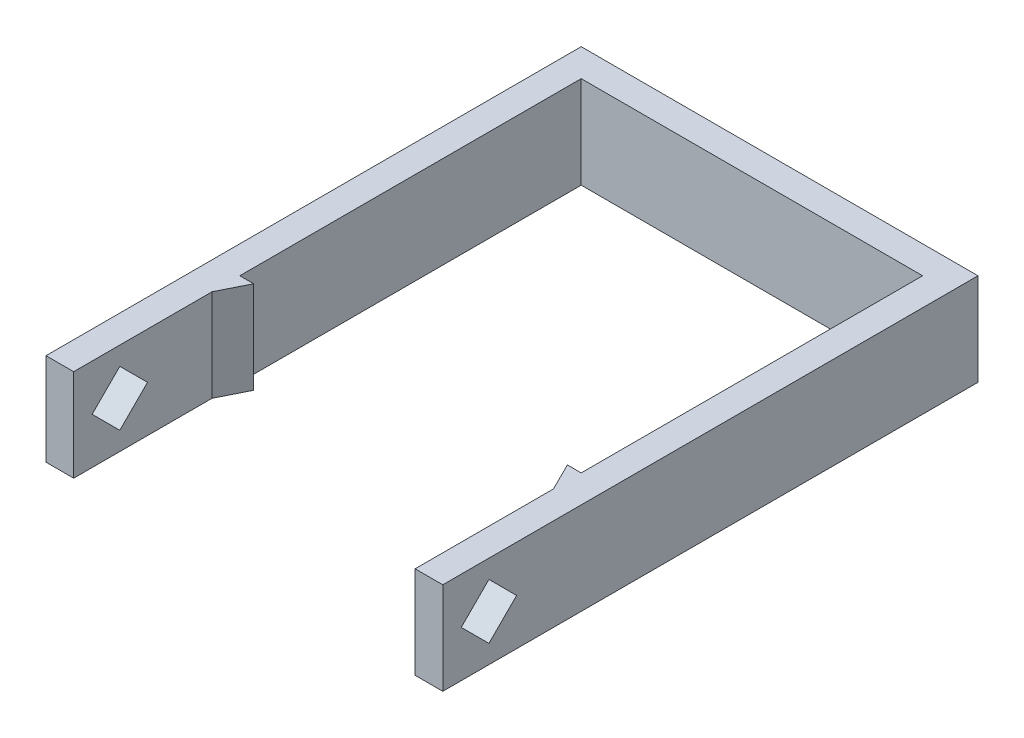
ISO-10303-21;
HEADER;
FILE_DESCRIPTION(('STEP AP214'),'2;1');
FILE_NAME('part.step','',(''),(''),'','','');
FILE_SCHEMA(('AUTOMOTIVE_DESIGN { 1 0 10303 214 1 1 1 1 }'));
ENDSEC;
DATA;
#1=APPLICATION_CONTEXT('core data for automotive mechanical design processes');
#2=APPLICATION_PROTOCOL_DEFINITION('international standard','automotive_design',2000,#1);
#3=PRODUCT_CONTEXT('',#1,'mechanical');
#4=PRODUCT('Part','Part','',(#3));
#5=PRODUCT_RELATED_PRODUCT_CATEGORY('part','',(#4));
#6=PRODUCT_DEFINITION_FORMATION('','',#4);
#7=PRODUCT_DEFINITION_CONTEXT('part definition',#1,'design');
#8=PRODUCT_DEFINITION('design','',#6,#7);
#9=PRODUCT_DEFINITION_SHAPE('','',#8);
#10=(LENGTH_UNIT() NAMED_UNIT(*) SI_UNIT(.MILLI.,.METRE.));
#11=(NAMED_UNIT(*) PLANE_ANGLE_UNIT() SI_UNIT($,.RADIAN.));
#12=(NAMED_UNIT(*) SI_UNIT($,.STERADIAN.) SOLID_ANGLE_UNIT());
#13=UNCERTAINTY_MEASURE_WITH_UNIT(LENGTH_MEASURE(1.E-05),#10,'distance_accuracy_value','');
#14=(GEOMETRIC_REPRESENTATION_CONTEXT(3) GLOBAL_UNCERTAINTY_ASSIGNED_CONTEXT((#13)) GLOBAL_UNIT_ASSIGNED_CONTEXT((#10,
#11,#12)) REPRESENTATION_CONTEXT('',''));
#15=CARTESIAN_POINT('',(0.,0.,0.));
#16=DIRECTION('',(0.,0.,1.));
#17=DIRECTION('',(1.,0.,0.));
#18=AXIS2_PLACEMENT_3D('',#15,#16,#17);
#19=CARTESIAN_POINT('',(18.5,10.,0.));
#20=DIRECTION('',(-1.,0.,0.));
#21=DIRECTION('',(0.,0.,1.));
#22=AXIS2_PLACEMENT_3D('',#19,#20,#21);
#23=PLANE('',#22);
#24=DIRECTION('',(0.,0.,-1.));
#25=VECTOR('',#24,1.);
#26=CARTESIAN_POINT('',(18.5,0.,0.));
#27=LINE('',#26,#25);
#28=CARTESIAN_POINT('',(18.5,0.,18.5));
#29=VERTEX_POINT('',#28);
#30=CARTESIAN_POINT('',(18.5,0.,-18.5));
#31=VERTEX_POINT('',#30);
#32=EDGE_CURVE('E242',#29,#31,#27,.T.);
#33=ORIENTED_EDGE('',*,*,#32,.F.);
#34=DIRECTION('',(0.,-1.,0.));
#35=VECTOR('',#34,1.);
#36=CARTESIAN_POINT('',(18.5,10.,18.5));
#37=LINE('',#36,#35);
#38=CARTESIAN_POINT('',(18.5,10.,18.5));
#39=VERTEX_POINT('',#38);
#40=EDGE_CURVE('E345',#39,#29,#37,.T.);
#41=ORIENTED_EDGE('',*,*,#40,.F.);
#42=DIRECTION('',(0.,0.,-1.));
#43=VECTOR('',#42,1.);
#44=CARTESIAN_POINT('',(18.5,10.,0.));
#45=LINE('',#44,#43);
#46=CARTESIAN_POINT('',(18.5,10.,-18.5));
#47=VERTEX_POINT('',#46);
#48=EDGE_CURVE('E243',#39,#47,#45,.T.);
#49=ORIENTED_EDGE('',*,*,#48,.T.);
#50=DIRECTION('',(0.,-1.,0.));
#51=VECTOR('',#50,1.);
#52=CARTESIAN_POINT('',(18.5,10.,-18.5));
#53=LINE('',#52,#51);
#54=EDGE_CURVE('E279',#47,#31,#53,.T.);
#55=ORIENTED_EDGE('',*,*,#54,.T.);
#56=EDGE_LOOP('',(#33,#41,#49,#55));
#57=FACE_BOUND('',#56,.T.);
#58=ADVANCED_FACE('F35',(#57),#23,.T.);
#59=CARTESIAN_POINT('',(0.,10.,18.5));
#60=DIRECTION('',(0.,0.,-1.));
#61=DIRECTION('',(-1.,0.,0.));
#62=AXIS2_PLACEMENT_3D('',#59,#60,#61);
#63=PLANE('',#62);
#64=DIRECTION('',(1.,0.,0.));
#65=VECTOR('',#64,1.);
#66=CARTESIAN_POINT('',(0.,0.,18.5));
#67=LINE('',#66,#65);
#68=CARTESIAN_POINT('',(17.,0.,18.5));
#69=VERTEX_POINT('',#68);
#70=EDGE_CURVE('E282',#69,#29,#67,.T.);
#71=ORIENTED_EDGE('',*,*,#70,.F.);
#72=DIRECTION('',(0.,-1.,0.));
#73=VECTOR('',#72,1.);
#74=CARTESIAN_POINT('',(17.,10.,18.5));
#75=LINE('',#74,#73);
#76=CARTESIAN_POINT('',(17.,10.,18.5));
#77=VERTEX_POINT('',#76);
#78=EDGE_CURVE('E343',#77,#69,#75,.T.);
#79=ORIENTED_EDGE('',*,*,#78,.F.);
#80=DIRECTION('',(1.,0.,0.));
#81=VECTOR('',#80,1.);
#82=CARTESIAN_POINT('',(0.,10.,18.5));
#83=LINE('',#82,#81);
#84=EDGE_CURVE('E246',#77,#39,#83,.T.);
#85=ORIENTED_EDGE('',*,*,#84,.T.);
#86=ORIENTED_EDGE('',*,*,#40,.T.);
#87=EDGE_LOOP('',(#71,#79,#85,#86));
#88=FACE_BOUND('',#87,.T.);
#89=ADVANCED_FACE('F374',(#88),#63,.T.);
#90=CARTESIAN_POINT('',(6.19999999999999,10.,-3.1));
#91=DIRECTION('',(-0.894427190999916,0.,0.447213595499958));
#92=DIRECTION('',(0.447213595499958,0.,0.894427190999916));
#93=AXIS2_PLACEMENT_3D('',#90,#91,#92);
#94=PLANE('',#93);
#95=DIRECTION('',(-0.447213595499958,0.,-0.894427190999916));
#96=VECTOR('',#95,1.);
#97=CARTESIAN_POINT('',(6.19999999999999,0.,-3.1));
#98=LINE('',#97,#96);
#99=CARTESIAN_POINT('',(18.5,0.,21.5));
#100=VERTEX_POINT('',#99);
#101=EDGE_CURVE('E285',#100,#69,#98,.T.);
#102=ORIENTED_EDGE('',*,*,#101,.F.);
#103=DIRECTION('',(0.,-1.,0.));
#104=VECTOR('',#103,1.);
#105=CARTESIAN_POINT('',(18.5,10.,21.5));
#106=LINE('',#105,#104);
#107=CARTESIAN_POINT('',(18.5,10.,21.5));
#108=VERTEX_POINT('',#107);
#109=EDGE_CURVE('E341',#108,#100,#106,.T.);
#110=ORIENTED_EDGE('',*,*,#109,.F.);
#111=DIRECTION('',(-0.447213595499958,0.,-0.894427190999916));
#112=VECTOR('',#111,1.);
#113=CARTESIAN_POINT('',(6.19999999999999,10.,-3.1));
#114=LINE('',#113,#112);
#115=EDGE_CURVE('E250',#108,#77,#114,.T.);
#116=ORIENTED_EDGE('',*,*,#115,.T.);
#117=ORIENTED_EDGE('',*,*,#78,.T.);
#118=EDGE_LOOP('',(#102,#110,#116,#117));
#119=FACE_BOUND('',#118,.T.);
#120=ADVANCED_FACE('F379',(#119),#94,.T.);
#121=CARTESIAN_POINT('',(18.5,10.,0.));
#122=DIRECTION('',(1.,0.,0.));
#123=DIRECTION('',(0.,0.,-1.));
#124=AXIS2_PLACEMENT_3D('',#121,#122,#123);
#125=PLANE('',#124);
#126=DIRECTION('',(0.,0.707106781186546,-0.707106781186549));
#127=VECTOR('',#126,1.);
#128=CARTESIAN_POINT('',(18.5,21.75,11.75));
#129=LINE('',#128,#127);
#130=CARTESIAN_POINT('',(18.5,2.,31.5));
#131=VERTEX_POINT('',#130);
#132=CARTESIAN_POINT('',(18.5,5.,28.5));
#133=VERTEX_POINT('',#132);
#134=EDGE_CURVE('E236',#131,#133,#129,.T.);
#135=ORIENTED_EDGE('',*,*,#134,.T.);
#136=DIRECTION('',(0.,0.707106781186547,0.707106781186548));
#137=VECTOR('',#136,1.);
#138=CARTESIAN_POINT('',(18.5,-6.74999999999999,16.75));
#139=LINE('',#138,#137);
#140=CARTESIAN_POINT('',(18.5,8.00000000000001,31.5));
#141=VERTEX_POINT('',#140);
#142=EDGE_CURVE('E239',#133,#141,#139,.T.);
#143=ORIENTED_EDGE('',*,*,#142,.T.);
#144=DIRECTION('',(0.,-0.707106781186548,0.707106781186547));
#145=VECTOR('',#144,1.);
#146=CARTESIAN_POINT('',(18.5,24.75,14.75));
#147=LINE('',#146,#145);
#148=CARTESIAN_POINT('',(18.5,5.,34.5));
#149=VERTEX_POINT('',#148);
#150=EDGE_CURVE('E224',#141,#149,#147,.T.);
#151=ORIENTED_EDGE('',*,*,#150,.T.);
#152=DIRECTION('',(0.,-0.707106781186547,-0.707106781186548));
#153=VECTOR('',#152,1.);
#154=CARTESIAN_POINT('',(18.5,-9.75000000000001,19.75));
#155=LINE('',#154,#153);
#156=EDGE_CURVE('E233',#149,#131,#155,.T.);
#157=ORIENTED_EDGE('',*,*,#156,.T.);
#158=EDGE_LOOP('',(#135,#143,#151,#157));
#159=FACE_BOUND('',#158,.T.);
#160=DIRECTION('',(0.,0.,1.));
#161=VECTOR('',#160,1.);
#162=CARTESIAN_POINT('',(18.5,0.,0.));
#163=LINE('',#162,#161);
#164=CARTESIAN_POINT('',(18.5,0.,36.5));
#165=VERTEX_POINT('',#164);
#166=EDGE_CURVE('E288',#100,#165,#163,.T.);
#167=ORIENTED_EDGE('',*,*,#166,.T.);
#168=DIRECTION('',(0.,-1.,0.));
#169=VECTOR('',#168,1.);
#170=CARTESIAN_POINT('',(18.5,10.,36.5));
#171=LINE('',#170,#169);
#172=CARTESIAN_POINT('',(18.5,10.,36.5));
#173=VERTEX_POINT('',#172);
#174=EDGE_CURVE('E338',#173,#165,#171,.T.);
#175=ORIENTED_EDGE('',*,*,#174,.F.);
#176=DIRECTION('',(0.,0.,1.));
#177=VECTOR('',#176,1.);
#178=CARTESIAN_POINT('',(18.5,10.,0.));
#179=LINE('',#178,#177);
#180=EDGE_CURVE('E253',#108,#173,#179,.T.);
#181=ORIENTED_EDGE('',*,*,#180,.F.);
#182=ORIENTED_EDGE('',*,*,#109,.T.);
#183=EDGE_LOOP('',(#167,#175,#181,#182));
#184=FACE_BOUND('',#183,.T.);
#185=ADVANCED_FACE('F397',(#159,#184),#125,.F.);
#186=CARTESIAN_POINT('',(0.,10.,36.5));
#187=DIRECTION('',(0.,0.,-1.));
#188=DIRECTION('',(-1.,0.,0.));
#189=AXIS2_PLACEMENT_3D('',#186,#187,#188);
#190=PLANE('',#189);
#191=DIRECTION('',(1.,0.,0.));
#192=VECTOR('',#191,1.);
#193=CARTESIAN_POINT('',(0.,0.,36.5));
#194=LINE('',#193,#192);
#195=CARTESIAN_POINT('',(21.5,0.,36.5));
#196=VERTEX_POINT('',#195);
#197=EDGE_CURVE('E290',#165,#196,#194,.T.);
#198=ORIENTED_EDGE('',*,*,#197,.T.);
#199=DIRECTION('',(0.,-1.,0.));
#200=VECTOR('',#199,1.);
#201=CARTESIAN_POINT('',(21.5,10.,36.5));
#202=LINE('',#201,#200);
#203=CARTESIAN_POINT('',(21.5,10.,36.5));
#204=VERTEX_POINT('',#203);
#205=EDGE_CURVE('E335',#204,#196,#202,.T.);
#206=ORIENTED_EDGE('',*,*,#205,.F.);
#207=DIRECTION('',(1.,0.,0.));
#208=VECTOR('',#207,1.);
#209=CARTESIAN_POINT('',(0.,10.,36.5));
#210=LINE('',#209,#208);
#211=EDGE_CURVE('E255',#173,#204,#210,.T.);
#212=ORIENTED_EDGE('',*,*,#211,.F.);
#213=ORIENTED_EDGE('',*,*,#174,.T.);
#214=EDGE_LOOP('',(#198,#206,#212,#213));
#215=FACE_BOUND('',#214,.T.);
#216=ADVANCED_FACE('F404',(#215),#190,.F.);
#217=CARTESIAN_POINT('',(21.5,10.,0.));
#218=DIRECTION('',(-1.,0.,0.));
#219=DIRECTION('',(0.,0.,1.));
#220=AXIS2_PLACEMENT_3D('',#217,#218,#219);
#221=PLANE('',#220);
#222=DIRECTION('',(0.,-0.707106781186548,0.707106781186547));
#223=VECTOR('',#222,1.);
#224=CARTESIAN_POINT('',(21.5,8.00000000000001,31.5));
#225=LINE('',#224,#223);
#226=CARTESIAN_POINT('',(21.5,8.00000000000001,31.5));
#227=VERTEX_POINT('',#226);
#228=CARTESIAN_POINT('',(21.5,5.,34.5));
#229=VERTEX_POINT('',#228);
#230=EDGE_CURVE('E218',#227,#229,#225,.T.);
#231=ORIENTED_EDGE('',*,*,#230,.F.);
#232=DIRECTION('',(0.,0.707106781186547,0.707106781186547));
#233=VECTOR('',#232,1.);
#234=CARTESIAN_POINT('',(21.5,8.00000000000001,31.5));
#235=LINE('',#234,#233);
#236=CARTESIAN_POINT('',(21.5,5.,28.5));
#237=VERTEX_POINT('',#236);
#238=EDGE_CURVE('E57',#237,#227,#235,.T.);
#239=ORIENTED_EDGE('',*,*,#238,.F.);
#240=DIRECTION('',(0.,0.707106781186546,-0.707106781186549));
#241=VECTOR('',#240,1.);
#242=CARTESIAN_POINT('',(21.5,5.,28.5));
#243=LINE('',#242,#241);
#244=CARTESIAN_POINT('',(21.5,2.,31.5));
#245=VERTEX_POINT('',#244);
#246=EDGE_CURVE('E209',#245,#237,#243,.T.);
#247=ORIENTED_EDGE('',*,*,#246,.F.);
#248=DIRECTION('',(0.,-0.707106781186547,-0.707106781186548));
#249=VECTOR('',#248,1.);
#250=CARTESIAN_POINT('',(21.5,5.,34.5));
#251=LINE('',#250,#249);
#252=EDGE_CURVE('E212',#229,#245,#251,.T.);
#253=ORIENTED_EDGE('',*,*,#252,.F.);
#254=EDGE_LOOP('',(#231,#239,#247,#253));
#255=FACE_BOUND('',#254,.T.);
#256=DIRECTION('',(0.,0.,-1.));
#257=VECTOR('',#256,1.);
#258=CARTESIAN_POINT('',(21.5,0.,0.));
#259=LINE('',#258,#257);
#260=CARTESIAN_POINT('',(21.5,0.,-21.5));
#261=VERTEX_POINT('',#260);
#262=EDGE_CURVE('E292',#196,#261,#259,.T.);
#263=ORIENTED_EDGE('',*,*,#262,.T.);
#264=DIRECTION('',(0.,-1.,0.));
#265=VECTOR('',#264,1.);
#266=CARTESIAN_POINT('',(21.5,10.,-21.5));
#267=LINE('',#266,#265);
#268=CARTESIAN_POINT('',(21.5,10.,-21.5));
#269=VERTEX_POINT('',#268);
#270=EDGE_CURVE('E333',#269,#261,#267,.T.);
#271=ORIENTED_EDGE('',*,*,#270,.F.);
#272=DIRECTION('',(0.,0.,-1.));
#273=VECTOR('',#272,1.);
#274=CARTESIAN_POINT('',(21.5,10.,0.));
#275=LINE('',#274,#273);
#276=EDGE_CURVE('E257',#204,#269,#275,.T.);
#277=ORIENTED_EDGE('',*,*,#276,.F.);
#278=ORIENTED_EDGE('',*,*,#205,.T.);
#279=EDGE_LOOP('',(#263,#271,#277,#278));
#280=FACE_BOUND('',#279,.T.);
#281=ADVANCED_FACE('F408',(#255,#280),#221,.F.);
#282=CARTESIAN_POINT('',(0.,10.,-21.5));
#283=DIRECTION('',(0.,0.,-1.));
#284=DIRECTION('',(-1.,0.,0.));
#285=AXIS2_PLACEMENT_3D('',#282,#283,#284);
#286=PLANE('',#285);
#287=DIRECTION('',(1.,0.,0.));
#288=VECTOR('',#287,1.);
#289=CARTESIAN_POINT('',(0.,0.,-21.5));
#290=LINE('',#289,#288);
#291=CARTESIAN_POINT('',(-21.5,0.,-21.5));
#292=VERTEX_POINT('',#291);
#293=EDGE_CURVE('E295',#292,#261,#290,.T.);
#294=ORIENTED_EDGE('',*,*,#293,.F.);
#295=DIRECTION('',(0.,-1.,0.));
#296=VECTOR('',#295,1.);
#297=CARTESIAN_POINT('',(-21.5,10.,-21.5));
#298=LINE('',#297,#296);
#299=CARTESIAN_POINT('',(-21.5,10.,-21.5));
#300=VERTEX_POINT('',#299);
#301=EDGE_CURVE('E331',#300,#292,#298,.T.);
#302=ORIENTED_EDGE('',*,*,#301,.F.);
#303=DIRECTION('',(1.,0.,0.));
#304=VECTOR('',#303,1.);
#305=CARTESIAN_POINT('',(0.,10.,-21.5));
#306=LINE('',#305,#304);
#307=EDGE_CURVE('E259',#300,#269,#306,.T.);
#308=ORIENTED_EDGE('',*,*,#307,.T.);
#309=ORIENTED_EDGE('',*,*,#270,.T.);
#310=EDGE_LOOP('',(#294,#302,#308,#309));
#311=FACE_BOUND('',#310,.T.);
#312=ADVANCED_FACE('F411',(#311),#286,.T.);
#313=CARTESIAN_POINT('',(-21.5,10.,0.));
#314=DIRECTION('',(-1.,0.,0.));
#315=DIRECTION('',(0.,0.,1.));
#316=AXIS2_PLACEMENT_3D('',#313,#314,#315);
#317=PLANE('',#316);
#318=DIRECTION('',(0.,0.707106781186547,0.707106781186547));
#319=VECTOR('',#318,1.);
#320=CARTESIAN_POINT('',(-21.5,8.00000000000001,31.5));
#321=LINE('',#320,#319);
#322=CARTESIAN_POINT('',(-21.5,5.,28.5));
#323=VERTEX_POINT('',#322);
#324=CARTESIAN_POINT('',(-21.5,8.00000000000001,31.5));
#325=VERTEX_POINT('',#324);
#326=EDGE_CURVE('E188',#323,#325,#321,.T.);
#327=ORIENTED_EDGE('',*,*,#326,.T.);
#328=DIRECTION('',(0.,-0.707106781186548,0.707106781186547));
#329=VECTOR('',#328,1.);
#330=CARTESIAN_POINT('',(-21.5,8.00000000000001,31.5));
#331=LINE('',#330,#329);
#332=CARTESIAN_POINT('',(-21.5,5.,34.5));
#333=VERTEX_POINT('',#332);
#334=EDGE_CURVE('E197',#325,#333,#331,.T.);
#335=ORIENTED_EDGE('',*,*,#334,.T.);
#336=DIRECTION('',(0.,-0.707106781186547,-0.707106781186548));
#337=VECTOR('',#336,1.);
#338=CARTESIAN_POINT('',(-21.5,5.,34.5));
#339=LINE('',#338,#337);
#340=CARTESIAN_POINT('',(-21.5,2.,31.5));
#341=VERTEX_POINT('',#340);
#342=EDGE_CURVE('E203',#333,#341,#339,.T.);
#343=ORIENTED_EDGE('',*,*,#342,.T.);
#344=DIRECTION('',(0.,0.707106781186546,-0.707106781186549));
#345=VECTOR('',#344,1.);
#346=CARTESIAN_POINT('',(-21.5,5.,28.5));
#347=LINE('',#346,#345);
#348=EDGE_CURVE('E208',#341,#323,#347,.T.);
#349=ORIENTED_EDGE('',*,*,#348,.T.);
#350=EDGE_LOOP('',(#327,#335,#343,#349));
#351=FACE_BOUND('',#350,.T.);
#352=DIRECTION('',(0.,0.,-1.));
#353=VECTOR('',#352,1.);
#354=CARTESIAN_POINT('',(-21.5,0.,0.));
#355=LINE('',#354,#353);
#356=CARTESIAN_POINT('',(-21.5,0.,36.5));
#357=VERTEX_POINT('',#356);
#358=EDGE_CURVE('E298',#357,#292,#355,.T.);
#359=ORIENTED_EDGE('',*,*,#358,.F.);
#360=DIRECTION('',(0.,-1.,0.));
#361=VECTOR('',#360,1.);
#362=CARTESIAN_POINT('',(-21.5,10.,36.5));
#363=LINE('',#362,#361);
#364=CARTESIAN_POINT('',(-21.5,10.,36.5));
#365=VERTEX_POINT('',#364);
#366=EDGE_CURVE('E329',#365,#357,#363,.T.);
#367=ORIENTED_EDGE('',*,*,#366,.F.);
#368=DIRECTION('',(0.,0.,-1.));
#369=VECTOR('',#368,1.);
#370=CARTESIAN_POINT('',(-21.5,10.,0.));
#371=LINE('',#370,#369);
#372=EDGE_CURVE('E262',#365,#300,#371,.T.);
#373=ORIENTED_EDGE('',*,*,#372,.T.);
#374=ORIENTED_EDGE('',*,*,#301,.T.);
#375=EDGE_LOOP('',(#359,#367,#373,#374));
#376=FACE_BOUND('',#375,.T.);
#377=ADVANCED_FACE('F205',(#351,#376),#317,.T.);
#378=CARTESIAN_POINT('',(0.,10.,36.5));
#379=DIRECTION('',(0.,0.,-1.));
#380=DIRECTION('',(-1.,0.,0.));
#381=AXIS2_PLACEMENT_3D('',#378,#379,#380);
#382=PLANE('',#381);
#383=DIRECTION('',(1.,0.,0.));
#384=VECTOR('',#383,1.);
#385=CARTESIAN_POINT('',(0.,0.,36.5));
#386=LINE('',#385,#384);
#387=CARTESIAN_POINT('',(-18.5,0.,36.5));
#388=VERTEX_POINT('',#387);
#389=EDGE_CURVE('E301',#357,#388,#386,.T.);
#390=ORIENTED_EDGE('',*,*,#389,.T.);
#391=DIRECTION('',(0.,-1.,0.));
#392=VECTOR('',#391,1.);
#393=CARTESIAN_POINT('',(-18.5,10.,36.5));
#394=LINE('',#393,#392);
#395=CARTESIAN_POINT('',(-18.5,10.,36.5));
#396=VERTEX_POINT('',#395);
#397=EDGE_CURVE('E327',#396,#388,#394,.T.);
#398=ORIENTED_EDGE('',*,*,#397,.F.);
#399=DIRECTION('',(1.,0.,0.));
#400=VECTOR('',#399,1.);
#401=CARTESIAN_POINT('',(0.,10.,36.5));
#402=LINE('',#401,#400);
#403=EDGE_CURVE('E265',#365,#396,#402,.T.);
#404=ORIENTED_EDGE('',*,*,#403,.F.);
#405=ORIENTED_EDGE('',*,*,#366,.T.);
#406=EDGE_LOOP('',(#390,#398,#404,#405));
#407=FACE_BOUND('',#406,.T.);
#408=ADVANCED_FACE('F418',(#407),#382,.F.);
#409=CARTESIAN_POINT('',(-18.5,10.,0.));
#410=DIRECTION('',(1.,0.,0.));
#411=DIRECTION('',(0.,0.,-1.));
#412=AXIS2_PLACEMENT_3D('',#409,#410,#411);
#413=PLANE('',#412);
#414=DIRECTION('',(0.,0.707106781186547,0.707106781186548));
#415=VECTOR('',#414,1.);
#416=CARTESIAN_POINT('',(-18.5,-6.74999999999999,16.75));
#417=LINE('',#416,#415);
#418=CARTESIAN_POINT('',(-18.5,5.,28.5));
#419=VERTEX_POINT('',#418);
#420=CARTESIAN_POINT('',(-18.5,8.00000000000001,31.5));
#421=VERTEX_POINT('',#420);
#422=EDGE_CURVE('E11',#419,#421,#417,.T.);
#423=ORIENTED_EDGE('',*,*,#422,.F.);
#424=DIRECTION('',(0.,0.707106781186546,-0.707106781186549));
#425=VECTOR('',#424,1.);
#426=CARTESIAN_POINT('',(-18.5,21.75,11.75));
#427=LINE('',#426,#425);
#428=CARTESIAN_POINT('',(-18.5,2.,31.5));
#429=VERTEX_POINT('',#428);
#430=EDGE_CURVE('E42',#429,#419,#427,.T.);
#431=ORIENTED_EDGE('',*,*,#430,.F.);
#432=DIRECTION('',(0.,-0.707106781186547,-0.707106781186548));
#433=VECTOR('',#432,1.);
#434=CARTESIAN_POINT('',(-18.5,-9.75000000000001,19.75));
#435=LINE('',#434,#433);
#436=CARTESIAN_POINT('',(-18.5,5.,34.5));
#437=VERTEX_POINT('',#436);
#438=EDGE_CURVE('E349',#437,#429,#435,.T.);
#439=ORIENTED_EDGE('',*,*,#438,.F.);
#440=DIRECTION('',(0.,-0.707106781186548,0.707106781186547));
#441=VECTOR('',#440,1.);
#442=CARTESIAN_POINT('',(-18.5,24.75,14.75));
#443=LINE('',#442,#441);
#444=EDGE_CURVE('E347',#421,#437,#443,.T.);
#445=ORIENTED_EDGE('',*,*,#444,.F.);
#446=EDGE_LOOP('',(#423,#431,#439,#445));
#447=FACE_BOUND('',#446,.T.);
#448=DIRECTION('',(0.,0.,1.));
#449=VECTOR('',#448,1.);
#450=CARTESIAN_POINT('',(-18.5,0.,0.));
#451=LINE('',#450,#449);
#452=CARTESIAN_POINT('',(-18.5,0.,21.5));
#453=VERTEX_POINT('',#452);
#454=EDGE_CURVE('E304',#453,#388,#451,.T.);
#455=ORIENTED_EDGE('',*,*,#454,.F.);
#456=DIRECTION('',(0.,-1.,0.));
#457=VECTOR('',#456,1.);
#458=CARTESIAN_POINT('',(-18.5,10.,21.5));
#459=LINE('',#458,#457);
#460=CARTESIAN_POINT('',(-18.5,10.,21.5));
#461=VERTEX_POINT('',#460);
#462=EDGE_CURVE('E325',#461,#453,#459,.T.);
#463=ORIENTED_EDGE('',*,*,#462,.F.);
#464=DIRECTION('',(0.,0.,1.));
#465=VECTOR('',#464,1.);
#466=CARTESIAN_POINT('',(-18.5,10.,0.));
#467=LINE('',#466,#465);
#468=EDGE_CURVE('E267',#461,#396,#467,.T.);
#469=ORIENTED_EDGE('',*,*,#468,.T.);
#470=ORIENTED_EDGE('',*,*,#397,.T.);
#471=EDGE_LOOP('',(#455,#463,#469,#470));
#472=FACE_BOUND('',#471,.T.);
#473=ADVANCED_FACE('F355',(#447,#472),#413,.T.);
#474=CARTESIAN_POINT('',(-6.19999999999999,10.,-3.1));
#475=DIRECTION('',(-0.894427190999916,0.,-0.447213595499958));
#476=DIRECTION('',(-0.447213595499958,0.,0.894427190999916));
#477=AXIS2_PLACEMENT_3D('',#474,#475,#476);
#478=PLANE('',#477);
#479=DIRECTION('',(0.447213595499958,0.,-0.894427190999916));
#480=VECTOR('',#479,1.);
#481=CARTESIAN_POINT('',(-6.19999999999999,0.,-3.1));
#482=LINE('',#481,#480);
#483=CARTESIAN_POINT('',(-17.,0.,18.5));
#484=VERTEX_POINT('',#483);
#485=EDGE_CURVE('E307',#453,#484,#482,.T.);
#486=ORIENTED_EDGE('',*,*,#485,.T.);
#487=DIRECTION('',(0.,-1.,0.));
#488=VECTOR('',#487,1.);
#489=CARTESIAN_POINT('',(-17.,10.,18.5));
#490=LINE('',#489,#488);
#491=CARTESIAN_POINT('',(-17.,10.,18.5));
#492=VERTEX_POINT('',#491);
#493=EDGE_CURVE('E322',#492,#484,#490,.T.);
#494=ORIENTED_EDGE('',*,*,#493,.F.);
#495=DIRECTION('',(0.447213595499958,0.,-0.894427190999916));
#496=VECTOR('',#495,1.);
#497=CARTESIAN_POINT('',(-6.19999999999999,10.,-3.1));
#498=LINE('',#497,#496);
#499=EDGE_CURVE('E270',#461,#492,#498,.T.);
#500=ORIENTED_EDGE('',*,*,#499,.F.);
#501=ORIENTED_EDGE('',*,*,#462,.T.);
#502=EDGE_LOOP('',(#486,#494,#500,#501));
#503=FACE_BOUND('',#502,.T.);
#504=ADVANCED_FACE('F425',(#503),#478,.F.);
#505=CARTESIAN_POINT('',(0.,10.,18.5));
#506=DIRECTION('',(0.,0.,1.));
#507=DIRECTION('',(1.,0.,0.));
#508=AXIS2_PLACEMENT_3D('',#505,#506,#507);
#509=PLANE('',#508);
#510=DIRECTION('',(-1.,0.,0.));
#511=VECTOR('',#510,1.);
#512=CARTESIAN_POINT('',(0.,0.,18.5));
#513=LINE('',#512,#511);
#514=CARTESIAN_POINT('',(-18.5,0.,18.5));
#515=VERTEX_POINT('',#514);
#516=EDGE_CURVE('E309',#484,#515,#513,.T.);
#517=ORIENTED_EDGE('',*,*,#516,.T.);
#518=DIRECTION('',(0.,-1.,0.));
#519=VECTOR('',#518,1.);
#520=CARTESIAN_POINT('',(-18.5,10.,18.5));
#521=LINE('',#520,#519);
#522=CARTESIAN_POINT('',(-18.5,10.,18.5));
#523=VERTEX_POINT('',#522);
#524=EDGE_CURVE('E320',#523,#515,#521,.T.);
#525=ORIENTED_EDGE('',*,*,#524,.F.);
#526=DIRECTION('',(-1.,0.,0.));
#527=VECTOR('',#526,1.);
#528=CARTESIAN_POINT('',(0.,10.,18.5));
#529=LINE('',#528,#527);
#530=EDGE_CURVE('E272',#492,#523,#529,.T.);
#531=ORIENTED_EDGE('',*,*,#530,.F.);
#532=ORIENTED_EDGE('',*,*,#493,.T.);
#533=EDGE_LOOP('',(#517,#525,#531,#532));
#534=FACE_BOUND('',#533,.T.);
#535=ADVANCED_FACE('F430',(#534),#509,.F.);
#536=CARTESIAN_POINT('',(-18.5,10.,0.));
#537=DIRECTION('',(1.,0.,0.));
#538=DIRECTION('',(0.,0.,-1.));
#539=AXIS2_PLACEMENT_3D('',#536,#537,#538);
#540=PLANE('',#539);
#541=DIRECTION('',(0.,0.,1.));
#542=VECTOR('',#541,1.);
#543=CARTESIAN_POINT('',(-18.5,0.,0.));
#544=LINE('',#543,#542);
#545=CARTESIAN_POINT('',(-18.5,0.,-18.5));
#546=VERTEX_POINT('',#545);
#547=EDGE_CURVE('E312',#546,#515,#544,.T.);
#548=ORIENTED_EDGE('',*,*,#547,.F.);
#549=DIRECTION('',(0.,-1.,0.));
#550=VECTOR('',#549,1.);
#551=CARTESIAN_POINT('',(-18.5,10.,-18.5));
#552=LINE('',#551,#550);
#553=CARTESIAN_POINT('',(-18.5,10.,-18.5));
#554=VERTEX_POINT('',#553);
#555=EDGE_CURVE('E318',#554,#546,#552,.T.);
#556=ORIENTED_EDGE('',*,*,#555,.F.);
#557=DIRECTION('',(0.,0.,1.));
#558=VECTOR('',#557,1.);
#559=CARTESIAN_POINT('',(-18.5,10.,0.));
#560=LINE('',#559,#558);
#561=EDGE_CURVE('E274',#554,#523,#560,.T.);
#562=ORIENTED_EDGE('',*,*,#561,.T.);
#563=ORIENTED_EDGE('',*,*,#524,.T.);
#564=EDGE_LOOP('',(#548,#556,#562,#563));
#565=FACE_BOUND('',#564,.T.);
#566=ADVANCED_FACE('F435',(#565),#540,.T.);
#567=CARTESIAN_POINT('',(0.,10.,-18.5));
#568=DIRECTION('',(0.,0.,-1.));
#569=DIRECTION('',(-1.,0.,0.));
#570=AXIS2_PLACEMENT_3D('',#567,#568,#569);
#571=PLANE('',#570);
#572=DIRECTION('',(1.,0.,0.));
#573=VECTOR('',#572,1.);
#574=CARTESIAN_POINT('',(0.,0.,-18.5));
#575=LINE('',#574,#573);
#576=EDGE_CURVE('E247',#546,#31,#575,.T.);
#577=ORIENTED_EDGE('',*,*,#576,.T.);
#578=ORIENTED_EDGE('',*,*,#54,.F.);
#579=DIRECTION('',(1.,0.,0.));
#580=VECTOR('',#579,1.);
#581=CARTESIAN_POINT('',(0.,10.,-18.5));
#582=LINE('',#581,#580);
#583=EDGE_CURVE('E277',#554,#47,#582,.T.);
#584=ORIENTED_EDGE('',*,*,#583,.F.);
#585=ORIENTED_EDGE('',*,*,#555,.T.);
#586=EDGE_LOOP('',(#577,#578,#584,#585));
#587=FACE_BOUND('',#586,.T.);
#588=ADVANCED_FACE('F437',(#587),#571,.F.);
#589=CARTESIAN_POINT('',(0.,10.,0.));
#590=DIRECTION('',(0.,1.,0.));
#591=DIRECTION('',(0.,0.,1.));
#592=AXIS2_PLACEMENT_3D('',#589,#590,#591);
#593=PLANE('',#592);
#594=ORIENTED_EDGE('',*,*,#48,.F.);
#595=ORIENTED_EDGE('',*,*,#84,.F.);
#596=ORIENTED_EDGE('',*,*,#115,.F.);
#597=ORIENTED_EDGE('',*,*,#180,.T.);
#598=ORIENTED_EDGE('',*,*,#211,.T.);
#599=ORIENTED_EDGE('',*,*,#276,.T.);
#600=ORIENTED_EDGE('',*,*,#307,.F.);
#601=ORIENTED_EDGE('',*,*,#372,.F.);
#602=ORIENTED_EDGE('',*,*,#403,.T.);
#603=ORIENTED_EDGE('',*,*,#468,.F.);
#604=ORIENTED_EDGE('',*,*,#499,.T.);
#605=ORIENTED_EDGE('',*,*,#530,.T.);
#606=ORIENTED_EDGE('',*,*,#561,.F.);
#607=ORIENTED_EDGE('',*,*,#583,.T.);
#608=EDGE_LOOP('',(#594,#595,#596,#597,#598,#599,#600,#601,#602,#603,#604,#605,#606,#607));
#609=FACE_BOUND('',#608,.T.);
#610=ADVANCED_FACE('F392',(#609),#593,.T.);
#611=CARTESIAN_POINT('',(0.,0.,0.));
#612=DIRECTION('',(0.,1.,0.));
#613=DIRECTION('',(0.,0.,1.));
#614=AXIS2_PLACEMENT_3D('',#611,#612,#613);
#615=PLANE('',#614);
#616=ORIENTED_EDGE('',*,*,#32,.T.);
#617=ORIENTED_EDGE('',*,*,#576,.F.);
#618=ORIENTED_EDGE('',*,*,#547,.T.);
#619=ORIENTED_EDGE('',*,*,#516,.F.);
#620=ORIENTED_EDGE('',*,*,#485,.F.);
#621=ORIENTED_EDGE('',*,*,#454,.T.);
#622=ORIENTED_EDGE('',*,*,#389,.F.);
#623=ORIENTED_EDGE('',*,*,#358,.T.);
#624=ORIENTED_EDGE('',*,*,#293,.T.);
#625=ORIENTED_EDGE('',*,*,#262,.F.);
#626=ORIENTED_EDGE('',*,*,#197,.F.);
#627=ORIENTED_EDGE('',*,*,#166,.F.);
#628=ORIENTED_EDGE('',*,*,#101,.T.);
#629=ORIENTED_EDGE('',*,*,#70,.T.);
#630=EDGE_LOOP('',(#616,#617,#618,#619,#620,#621,#622,#623,#624,#625,#626,#627,#628,#629));
#631=FACE_BOUND('',#630,.T.);
#632=ADVANCED_FACE('F368',(#631),#615,.F.);
#633=CARTESIAN_POINT('',(-21.5,8.00000000000001,31.5));
#634=DIRECTION('',(0.,0.707106781186547,0.707106781186548));
#635=DIRECTION('',(0.,-0.707106781186548,0.707106781186547));
#636=AXIS2_PLACEMENT_3D('',#633,#634,#635);
#637=PLANE('',#636);
#638=ORIENTED_EDGE('',*,*,#444,.T.);
#639=DIRECTION('',(1.,0.,0.));
#640=VECTOR('',#639,1.);
#641=CARTESIAN_POINT('',(-21.5,5.,34.5));
#642=LINE('',#641,#640);
#643=EDGE_CURVE('E200',#333,#437,#642,.T.);
#644=ORIENTED_EDGE('',*,*,#643,.F.);
#645=ORIENTED_EDGE('',*,*,#334,.F.);
#646=DIRECTION('',(1.,0.,0.));
#647=VECTOR('',#646,1.);
#648=CARTESIAN_POINT('',(-21.5,8.00000000000001,31.5));
#649=LINE('',#648,#647);
#650=EDGE_CURVE('E183',#325,#421,#649,.T.);
#651=ORIENTED_EDGE('',*,*,#650,.T.);
#652=EDGE_LOOP('',(#638,#644,#645,#651));
#653=FACE_BOUND('',#652,.T.);
#654=ADVANCED_FACE('F198',(#653),#637,.F.);
#655=CARTESIAN_POINT('',(-21.5,5.,34.5));
#656=DIRECTION('',(0.,-0.707106781186548,0.707106781186547));
#657=DIRECTION('',(0.,-0.707106781186547,-0.707106781186548));
#658=AXIS2_PLACEMENT_3D('',#655,#656,#657);
#659=PLANE('',#658);
#660=ORIENTED_EDGE('',*,*,#438,.T.);
#661=DIRECTION('',(1.,0.,0.));
#662=VECTOR('',#661,1.);
#663=CARTESIAN_POINT('',(-21.5,2.,31.5));
#664=LINE('',#663,#662);
#665=EDGE_CURVE('E226',#341,#429,#664,.T.);
#666=ORIENTED_EDGE('',*,*,#665,.F.);
#667=ORIENTED_EDGE('',*,*,#342,.F.);
#668=ORIENTED_EDGE('',*,*,#643,.T.);
#669=EDGE_LOOP('',(#660,#666,#667,#668));
#670=FACE_BOUND('',#669,.T.);
#671=ADVANCED_FACE('F358',(#670),#659,.F.);
#672=CARTESIAN_POINT('',(-21.5,5.,28.5));
#673=DIRECTION('',(0.,-0.707106781186549,-0.707106781186546));
#674=DIRECTION('',(0.,0.707106781186546,-0.707106781186549));
#675=AXIS2_PLACEMENT_3D('',#672,#673,#674);
#676=PLANE('',#675);
#677=ORIENTED_EDGE('',*,*,#430,.T.);
#678=DIRECTION('',(1.,0.,0.));
#679=VECTOR('',#678,1.);
#680=CARTESIAN_POINT('',(-21.5,5.,28.5));
#681=LINE('',#680,#679);
#682=EDGE_CURVE('E222',#323,#419,#681,.T.);
#683=ORIENTED_EDGE('',*,*,#682,.F.);
#684=ORIENTED_EDGE('',*,*,#348,.F.);
#685=ORIENTED_EDGE('',*,*,#665,.T.);
#686=EDGE_LOOP('',(#677,#683,#684,#685));
#687=FACE_BOUND('',#686,.T.);
#688=ADVANCED_FACE('F352',(#687),#676,.F.);
#689=CARTESIAN_POINT('',(-21.5,8.00000000000001,31.5));
#690=DIRECTION('',(0.,0.707106781186548,-0.707106781186547));
#691=DIRECTION('',(0.,0.707106781186547,0.707106781186548));
#692=AXIS2_PLACEMENT_3D('',#689,#690,#691);
#693=PLANE('',#692);
#694=ORIENTED_EDGE('',*,*,#422,.T.);
#695=ORIENTED_EDGE('',*,*,#650,.F.);
#696=ORIENTED_EDGE('',*,*,#326,.F.);
#697=ORIENTED_EDGE('',*,*,#682,.T.);
#698=EDGE_LOOP('',(#694,#695,#696,#697));
#699=FACE_BOUND('',#698,.T.);
#700=ADVANCED_FACE('F185',(#699),#693,.F.);
#701=EDGE_CURVE('E225',#133,#237,#681,.T.);
#702=ORIENTED_EDGE('',*,*,#701,.T.);
#703=ORIENTED_EDGE('',*,*,#238,.T.);
#704=EDGE_CURVE('E193',#141,#227,#649,.T.);
#705=ORIENTED_EDGE('',*,*,#704,.F.);
#706=ORIENTED_EDGE('',*,*,#142,.F.);
#707=EDGE_LOOP('',(#702,#703,#705,#706));
#708=FACE_BOUND('',#707,.T.);
#709=ADVANCED_FACE('F560',(#708),#693,.F.);
#710=EDGE_CURVE('E229',#131,#245,#664,.T.);
#711=ORIENTED_EDGE('',*,*,#710,.T.);
#712=ORIENTED_EDGE('',*,*,#246,.T.);
#713=ORIENTED_EDGE('',*,*,#701,.F.);
#714=ORIENTED_EDGE('',*,*,#134,.F.);
#715=EDGE_LOOP('',(#711,#712,#713,#714));
#716=FACE_BOUND('',#715,.T.);
#717=ADVANCED_FACE('F367',(#716),#676,.F.);
#718=EDGE_CURVE('E49',#149,#229,#642,.T.);
#719=ORIENTED_EDGE('',*,*,#718,.T.);
#720=ORIENTED_EDGE('',*,*,#252,.T.);
#721=ORIENTED_EDGE('',*,*,#710,.F.);
#722=ORIENTED_EDGE('',*,*,#156,.F.);
#723=EDGE_LOOP('',(#719,#720,#721,#722));
#724=FACE_BOUND('',#723,.T.);
#725=ADVANCED_FACE('F361',(#724),#659,.F.);
#726=ORIENTED_EDGE('',*,*,#704,.T.);
#727=ORIENTED_EDGE('',*,*,#230,.T.);
#728=ORIENTED_EDGE('',*,*,#718,.F.);
#729=ORIENTED_EDGE('',*,*,#150,.F.);
#730=EDGE_LOOP('',(#726,#727,#728,#729));
#731=FACE_BOUND('',#730,.T.);
#732=ADVANCED_FACE('F370',(#731),#637,.F.);
#733=CLOSED_SHELL('',(#58,#89,#120,#185,#216,#281,#312,#377,#408,#473,#504,#535,#566,#588,#610,
#632,#654,#671,#688,#700,#709,#717,#725,#732));
#734=MANIFOLD_SOLID_BREP('B2',#733);
#735=ADVANCED_BREP_SHAPE_REPRESENTATION('',(#18,#734),#14);
#736=SHAPE_DEFINITION_REPRESENTATION(#9,#735);
ENDSEC;
END-ISO-10303-21;
